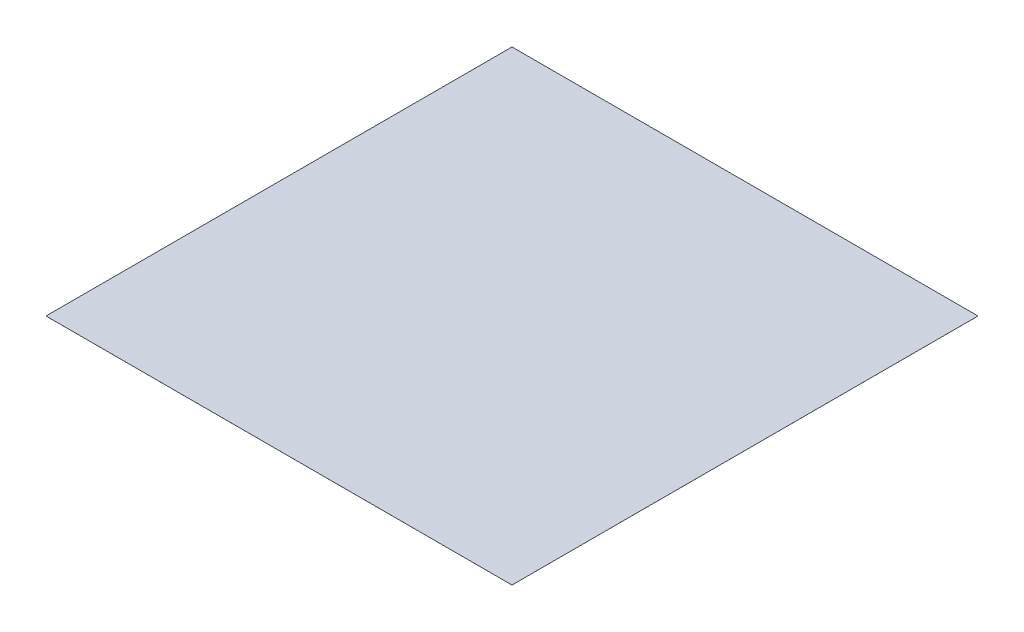
ISO-10303-21;
HEADER;
FILE_DESCRIPTION(('STEP AP214'),'2;1');
FILE_NAME('part.step','',(''),(''),'','','');
FILE_SCHEMA(('AUTOMOTIVE_DESIGN { 1 0 10303 214 1 1 1 1 }'));
ENDSEC;
DATA;
#1=APPLICATION_CONTEXT('core data for automotive mechanical design processes');
#2=APPLICATION_PROTOCOL_DEFINITION('international standard','automotive_design',2000,#1);
#3=PRODUCT_CONTEXT('',#1,'mechanical');
#4=PRODUCT('Part','Part','',(#3));
#5=PRODUCT_RELATED_PRODUCT_CATEGORY('part','',(#4));
#6=PRODUCT_DEFINITION_FORMATION('','',#4);
#7=PRODUCT_DEFINITION_CONTEXT('part definition',#1,'design');
#8=PRODUCT_DEFINITION('design','',#6,#7);
#9=PRODUCT_DEFINITION_SHAPE('','',#8);
#10=(LENGTH_UNIT() NAMED_UNIT(*) SI_UNIT(.MILLI.,.METRE.));
#11=(NAMED_UNIT(*) PLANE_ANGLE_UNIT() SI_UNIT($,.RADIAN.));
#12=(NAMED_UNIT(*) SI_UNIT($,.STERADIAN.) SOLID_ANGLE_UNIT());
#13=UNCERTAINTY_MEASURE_WITH_UNIT(LENGTH_MEASURE(1.E-05),#10,'distance_accuracy_value','');
#14=(GEOMETRIC_REPRESENTATION_CONTEXT(3) GLOBAL_UNCERTAINTY_ASSIGNED_CONTEXT((#13)) GLOBAL_UNIT_ASSIGNED_CONTEXT((#10,
#11,#12)) REPRESENTATION_CONTEXT('',''));
#15=CARTESIAN_POINT('',(0.,0.,0.));
#16=DIRECTION('',(0.,0.,1.));
#17=DIRECTION('',(1.,0.,0.));
#18=AXIS2_PLACEMENT_3D('',#15,#16,#17);
#19=CARTESIAN_POINT('',(-1500.,0.1,1500.));
#20=DIRECTION('',(1.,0.,0.));
#21=DIRECTION('',(0.,0.,-1.));
#22=AXIS2_PLACEMENT_3D('',#19,#20,#21);
#23=PLANE('',#22);
#24=DIRECTION('',(0.,0.,1.));
#25=VECTOR('',#24,1.);
#26=CARTESIAN_POINT('',(-1500.,0.,1500.));
#27=LINE('',#26,#25);
#28=CARTESIAN_POINT('',(-1500.,0.,-1500.));
#29=VERTEX_POINT('',#28);
#30=CARTESIAN_POINT('',(-1500.,0.,1500.));
#31=VERTEX_POINT('',#30);
#32=EDGE_CURVE('E107',#29,#31,#27,.T.);
#33=ORIENTED_EDGE('',*,*,#32,.T.);
#34=DIRECTION('',(0.,-1.,0.));
#35=VECTOR('',#34,1.);
#36=CARTESIAN_POINT('',(-1500.,0.1,1500.));
#37=LINE('',#36,#35);
#38=CARTESIAN_POINT('',(-1500.,0.1,1500.));
#39=VERTEX_POINT('',#38);
#40=EDGE_CURVE('E11',#39,#31,#37,.T.);
#41=ORIENTED_EDGE('',*,*,#40,.F.);
#42=DIRECTION('',(0.,0.,1.));
#43=VECTOR('',#42,1.);
#44=CARTESIAN_POINT('',(-1500.,0.1,1500.));
#45=LINE('',#44,#43);
#46=CARTESIAN_POINT('',(-1500.,0.1,-1500.));
#47=VERTEX_POINT('',#46);
#48=EDGE_CURVE('E91',#47,#39,#45,.T.);
#49=ORIENTED_EDGE('',*,*,#48,.F.);
#50=DIRECTION('',(0.,-1.,0.));
#51=VECTOR('',#50,1.);
#52=CARTESIAN_POINT('',(-1500.,0.1,-1500.));
#53=LINE('',#52,#51);
#54=EDGE_CURVE('E103',#47,#29,#53,.T.);
#55=ORIENTED_EDGE('',*,*,#54,.T.);
#56=EDGE_LOOP('',(#33,#41,#49,#55));
#57=FACE_BOUND('',#56,.T.);
#58=ADVANCED_FACE('F39',(#57),#23,.F.);
#59=CARTESIAN_POINT('',(1500.,0.1,1500.));
#60=DIRECTION('',(0.,0.,-1.));
#61=DIRECTION('',(-1.,0.,0.));
#62=AXIS2_PLACEMENT_3D('',#59,#60,#61);
#63=PLANE('',#62);
#64=DIRECTION('',(1.,0.,0.));
#65=VECTOR('',#64,1.);
#66=CARTESIAN_POINT('',(1500.,0.,1500.));
#67=LINE('',#66,#65);
#68=CARTESIAN_POINT('',(1500.,0.,1500.));
#69=VERTEX_POINT('',#68);
#70=EDGE_CURVE('E96',#31,#69,#67,.T.);
#71=ORIENTED_EDGE('',*,*,#70,.T.);
#72=DIRECTION('',(0.,-1.,0.));
#73=VECTOR('',#72,1.);
#74=CARTESIAN_POINT('',(1500.,0.1,1500.));
#75=LINE('',#74,#73);
#76=CARTESIAN_POINT('',(1500.,0.1,1500.));
#77=VERTEX_POINT('',#76);
#78=EDGE_CURVE('E48',#77,#69,#75,.T.);
#79=ORIENTED_EDGE('',*,*,#78,.F.);
#80=DIRECTION('',(1.,0.,0.));
#81=VECTOR('',#80,1.);
#82=CARTESIAN_POINT('',(1500.,0.1,1500.));
#83=LINE('',#82,#81);
#84=EDGE_CURVE('E86',#39,#77,#83,.T.);
#85=ORIENTED_EDGE('',*,*,#84,.F.);
#86=ORIENTED_EDGE('',*,*,#40,.T.);
#87=EDGE_LOOP('',(#71,#79,#85,#86));
#88=FACE_BOUND('',#87,.T.);
#89=ADVANCED_FACE('F95',(#88),#63,.F.);
#90=CARTESIAN_POINT('',(1500.,0.1,1500.));
#91=DIRECTION('',(-1.,0.,0.));
#92=DIRECTION('',(0.,0.,1.));
#93=AXIS2_PLACEMENT_3D('',#90,#91,#92);
#94=PLANE('',#93);
#95=DIRECTION('',(0.,0.,-1.));
#96=VECTOR('',#95,1.);
#97=CARTESIAN_POINT('',(1500.,0.,1500.));
#98=LINE('',#97,#96);
#99=CARTESIAN_POINT('',(1500.,0.,-1500.));
#100=VERTEX_POINT('',#99);
#101=EDGE_CURVE('E73',#69,#100,#98,.T.);
#102=ORIENTED_EDGE('',*,*,#101,.T.);
#103=DIRECTION('',(0.,-1.,0.));
#104=VECTOR('',#103,1.);
#105=CARTESIAN_POINT('',(1500.,0.1,-1500.));
#106=LINE('',#105,#104);
#107=CARTESIAN_POINT('',(1500.,0.1,-1500.));
#108=VERTEX_POINT('',#107);
#109=EDGE_CURVE('E98',#108,#100,#106,.T.);
#110=ORIENTED_EDGE('',*,*,#109,.F.);
#111=DIRECTION('',(0.,0.,-1.));
#112=VECTOR('',#111,1.);
#113=CARTESIAN_POINT('',(1500.,0.1,1500.));
#114=LINE('',#113,#112);
#115=EDGE_CURVE('E89',#77,#108,#114,.T.);
#116=ORIENTED_EDGE('',*,*,#115,.F.);
#117=ORIENTED_EDGE('',*,*,#78,.T.);
#118=EDGE_LOOP('',(#102,#110,#116,#117));
#119=FACE_BOUND('',#118,.T.);
#120=ADVANCED_FACE('F99',(#119),#94,.F.);
#121=CARTESIAN_POINT('',(1500.,0.1,-1500.));
#122=DIRECTION('',(0.,0.,1.));
#123=DIRECTION('',(1.,0.,0.));
#124=AXIS2_PLACEMENT_3D('',#121,#122,#123);
#125=PLANE('',#124);
#126=DIRECTION('',(-1.,0.,0.));
#127=VECTOR('',#126,1.);
#128=CARTESIAN_POINT('',(1500.,0.,-1500.));
#129=LINE('',#128,#127);
#130=EDGE_CURVE('E79',#100,#29,#129,.T.);
#131=ORIENTED_EDGE('',*,*,#130,.T.);
#132=ORIENTED_EDGE('',*,*,#54,.F.);
#133=DIRECTION('',(-1.,0.,0.));
#134=VECTOR('',#133,1.);
#135=CARTESIAN_POINT('',(1500.,0.1,-1500.));
#136=LINE('',#135,#134);
#137=EDGE_CURVE('E56',#108,#47,#136,.T.);
#138=ORIENTED_EDGE('',*,*,#137,.F.);
#139=ORIENTED_EDGE('',*,*,#109,.T.);
#140=EDGE_LOOP('',(#131,#132,#138,#139));
#141=FACE_BOUND('',#140,.T.);
#142=ADVANCED_FACE('F120',(#141),#125,.F.);
#143=CARTESIAN_POINT('',(0.,0.1,0.));
#144=DIRECTION('',(0.,1.,0.));
#145=DIRECTION('',(0.,0.,1.));
#146=AXIS2_PLACEMENT_3D('',#143,#144,#145);
#147=PLANE('',#146);
#148=ORIENTED_EDGE('',*,*,#48,.T.);
#149=ORIENTED_EDGE('',*,*,#84,.T.);
#150=ORIENTED_EDGE('',*,*,#115,.T.);
#151=ORIENTED_EDGE('',*,*,#137,.T.);
#152=EDGE_LOOP('',(#148,#149,#150,#151));
#153=FACE_BOUND('',#152,.T.);
#154=ADVANCED_FACE('F87',(#153),#147,.T.);
#155=CARTESIAN_POINT('',(0.,0.,0.));
#156=DIRECTION('',(0.,1.,0.));
#157=DIRECTION('',(0.,0.,1.));
#158=AXIS2_PLACEMENT_3D('',#155,#156,#157);
#159=PLANE('',#158);
#160=ORIENTED_EDGE('',*,*,#32,.F.);
#161=ORIENTED_EDGE('',*,*,#130,.F.);
#162=ORIENTED_EDGE('',*,*,#101,.F.);
#163=ORIENTED_EDGE('',*,*,#70,.F.);
#164=EDGE_LOOP('',(#160,#161,#162,#163));
#165=FACE_BOUND('',#164,.T.);
#166=ADVANCED_FACE('F123',(#165),#159,.F.);
#167=CLOSED_SHELL('',(#58,#89,#120,#142,#154,#166));
#168=MANIFOLD_SOLID_BREP('B2',#167);
#169=ADVANCED_BREP_SHAPE_REPRESENTATION('',(#18,#168),#14);
#170=SHAPE_DEFINITION_REPRESENTATION(#9,#169);
ENDSEC;
END-ISO-10303-21;
